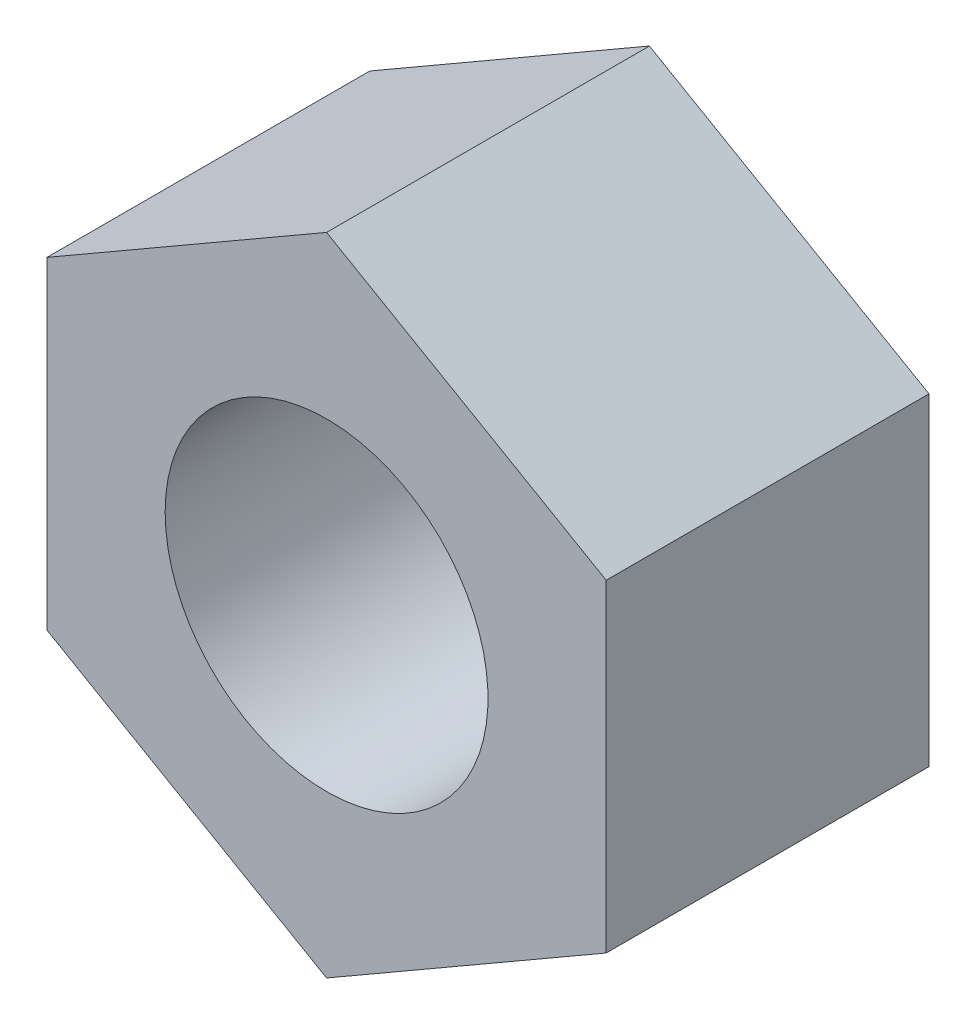
ISO-10303-21;
HEADER;
FILE_DESCRIPTION(('STEP AP214'),'2;1');
FILE_NAME('part.step','',(''),(''),'','','');
FILE_SCHEMA(('AUTOMOTIVE_DESIGN { 1 0 10303 214 1 1 1 1 }'));
ENDSEC;
DATA;
#1=APPLICATION_CONTEXT('core data for automotive mechanical design processes');
#2=APPLICATION_PROTOCOL_DEFINITION('international standard','automotive_design',2000,#1);
#3=PRODUCT_CONTEXT('',#1,'mechanical');
#4=PRODUCT('Part','Part','',(#3));
#5=PRODUCT_RELATED_PRODUCT_CATEGORY('part','',(#4));
#6=PRODUCT_DEFINITION_FORMATION('','',#4);
#7=PRODUCT_DEFINITION_CONTEXT('part definition',#1,'design');
#8=PRODUCT_DEFINITION('design','',#6,#7);
#9=PRODUCT_DEFINITION_SHAPE('','',#8);
#10=(LENGTH_UNIT() NAMED_UNIT(*) SI_UNIT(.MILLI.,.METRE.));
#11=(NAMED_UNIT(*) PLANE_ANGLE_UNIT() SI_UNIT($,.RADIAN.));
#12=(NAMED_UNIT(*) SI_UNIT($,.STERADIAN.) SOLID_ANGLE_UNIT());
#13=UNCERTAINTY_MEASURE_WITH_UNIT(LENGTH_MEASURE(1.E-05),#10,'distance_accuracy_value','');
#14=(GEOMETRIC_REPRESENTATION_CONTEXT(3) GLOBAL_UNCERTAINTY_ASSIGNED_CONTEXT((#13)) GLOBAL_UNIT_ASSIGNED_CONTEXT((#10,
#11,#12)) REPRESENTATION_CONTEXT('',''));
#15=CARTESIAN_POINT('',(0.,0.,0.));
#16=DIRECTION('',(0.,0.,1.));
#17=DIRECTION('',(1.,0.,0.));
#18=AXIS2_PLACEMENT_3D('',#15,#16,#17);
#19=CARTESIAN_POINT('',(2.59807621135332,1.5,3.));
#20=DIRECTION('',(-0.5,-0.866025403784439,0.));
#21=DIRECTION('',(0.866025403784439,-0.5,0.));
#22=AXIS2_PLACEMENT_3D('',#19,#20,#21);
#23=PLANE('',#22);
#24=DIRECTION('',(-0.866025403784439,0.5,0.));
#25=VECTOR('',#24,1.);
#26=CARTESIAN_POINT('',(2.59807621135332,1.5,0.));
#27=LINE('',#26,#25);
#28=CARTESIAN_POINT('',(2.59807621135332,1.5,0.));
#29=VERTEX_POINT('',#28);
#30=CARTESIAN_POINT('',(0.,3.,0.));
#31=VERTEX_POINT('',#30);
#32=EDGE_CURVE('E121',#29,#31,#27,.T.);
#33=ORIENTED_EDGE('',*,*,#32,.T.);
#34=DIRECTION('',(0.,0.,-1.));
#35=VECTOR('',#34,1.);
#36=CARTESIAN_POINT('',(0.,3.,3.));
#37=LINE('',#36,#35);
#38=CARTESIAN_POINT('',(0.,3.,3.));
#39=VERTEX_POINT('',#38);
#40=EDGE_CURVE('E11',#39,#31,#37,.T.);
#41=ORIENTED_EDGE('',*,*,#40,.F.);
#42=DIRECTION('',(-0.866025403784439,0.5,0.));
#43=VECTOR('',#42,1.);
#44=CARTESIAN_POINT('',(2.59807621135332,1.5,3.));
#45=LINE('',#44,#43);
#46=CARTESIAN_POINT('',(2.59807621135332,1.5,3.));
#47=VERTEX_POINT('',#46);
#48=EDGE_CURVE('E132',#47,#39,#45,.T.);
#49=ORIENTED_EDGE('',*,*,#48,.F.);
#50=DIRECTION('',(0.,0.,-1.));
#51=VECTOR('',#50,1.);
#52=CARTESIAN_POINT('',(2.59807621135332,1.5,3.));
#53=LINE('',#52,#51);
#54=EDGE_CURVE('E117',#47,#29,#53,.T.);
#55=ORIENTED_EDGE('',*,*,#54,.T.);
#56=EDGE_LOOP('',(#33,#41,#49,#55));
#57=FACE_BOUND('',#56,.T.);
#58=ADVANCED_FACE('F37',(#57),#23,.F.);
#59=CARTESIAN_POINT('',(0.,3.,3.));
#60=DIRECTION('',(0.5,-0.866025403784438,0.));
#61=DIRECTION('',(0.866025403784439,0.5,0.));
#62=AXIS2_PLACEMENT_3D('',#59,#60,#61);
#63=PLANE('',#62);
#64=DIRECTION('',(-0.866025403784439,-0.5,0.));
#65=VECTOR('',#64,1.);
#66=CARTESIAN_POINT('',(0.,3.,0.));
#67=LINE('',#66,#65);
#68=CARTESIAN_POINT('',(-2.59807621135332,1.5,0.));
#69=VERTEX_POINT('',#68);
#70=EDGE_CURVE('E124',#31,#69,#67,.T.);
#71=ORIENTED_EDGE('',*,*,#70,.T.);
#72=DIRECTION('',(0.,0.,-1.));
#73=VECTOR('',#72,1.);
#74=CARTESIAN_POINT('',(-2.59807621135332,1.5,3.));
#75=LINE('',#74,#73);
#76=CARTESIAN_POINT('',(-2.59807621135332,1.5,3.));
#77=VERTEX_POINT('',#76);
#78=EDGE_CURVE('E45',#77,#69,#75,.T.);
#79=ORIENTED_EDGE('',*,*,#78,.F.);
#80=DIRECTION('',(-0.866025403784439,-0.5,0.));
#81=VECTOR('',#80,1.);
#82=CARTESIAN_POINT('',(0.,3.,3.));
#83=LINE('',#82,#81);
#84=EDGE_CURVE('E90',#39,#77,#83,.T.);
#85=ORIENTED_EDGE('',*,*,#84,.F.);
#86=ORIENTED_EDGE('',*,*,#40,.T.);
#87=EDGE_LOOP('',(#71,#79,#85,#86));
#88=FACE_BOUND('',#87,.T.);
#89=ADVANCED_FACE('F157',(#88),#63,.F.);
#90=CARTESIAN_POINT('',(-2.59807621135332,1.5,3.));
#91=DIRECTION('',(1.,0.,0.));
#92=DIRECTION('',(0.,1.,0.));
#93=AXIS2_PLACEMENT_3D('',#90,#91,#92);
#94=PLANE('',#93);
#95=DIRECTION('',(0.,-1.,0.));
#96=VECTOR('',#95,1.);
#97=CARTESIAN_POINT('',(-2.59807621135332,1.5,0.));
#98=LINE('',#97,#96);
#99=CARTESIAN_POINT('',(-2.59807621135332,-1.5,0.));
#100=VERTEX_POINT('',#99);
#101=EDGE_CURVE('E127',#69,#100,#98,.T.);
#102=ORIENTED_EDGE('',*,*,#101,.T.);
#103=DIRECTION('',(0.,0.,-1.));
#104=VECTOR('',#103,1.);
#105=CARTESIAN_POINT('',(-2.59807621135332,-1.5,3.));
#106=LINE('',#105,#104);
#107=CARTESIAN_POINT('',(-2.59807621135332,-1.5,3.));
#108=VERTEX_POINT('',#107);
#109=EDGE_CURVE('E112',#108,#100,#106,.T.);
#110=ORIENTED_EDGE('',*,*,#109,.F.);
#111=DIRECTION('',(0.,-1.,0.));
#112=VECTOR('',#111,1.);
#113=CARTESIAN_POINT('',(-2.59807621135332,1.5,3.));
#114=LINE('',#113,#112);
#115=EDGE_CURVE('E103',#77,#108,#114,.T.);
#116=ORIENTED_EDGE('',*,*,#115,.F.);
#117=ORIENTED_EDGE('',*,*,#78,.T.);
#118=EDGE_LOOP('',(#102,#110,#116,#117));
#119=FACE_BOUND('',#118,.T.);
#120=ADVANCED_FACE('F138',(#119),#94,.F.);
#121=CARTESIAN_POINT('',(-2.59807621135332,-1.5,3.));
#122=DIRECTION('',(0.5,0.866025403784439,0.));
#123=DIRECTION('',(-0.866025403784439,0.5,0.));
#124=AXIS2_PLACEMENT_3D('',#121,#122,#123);
#125=PLANE('',#124);
#126=DIRECTION('',(0.866025403784439,-0.5,0.));
#127=VECTOR('',#126,1.);
#128=CARTESIAN_POINT('',(-2.59807621135332,-1.5,0.));
#129=LINE('',#128,#127);
#130=CARTESIAN_POINT('',(0.,-3.,0.));
#131=VERTEX_POINT('',#130);
#132=EDGE_CURVE('E111',#100,#131,#129,.T.);
#133=ORIENTED_EDGE('',*,*,#132,.T.);
#134=DIRECTION('',(0.,0.,-1.));
#135=VECTOR('',#134,1.);
#136=CARTESIAN_POINT('',(0.,-3.,3.));
#137=LINE('',#136,#135);
#138=CARTESIAN_POINT('',(0.,-3.,3.));
#139=VERTEX_POINT('',#138);
#140=EDGE_CURVE('E108',#139,#131,#137,.T.);
#141=ORIENTED_EDGE('',*,*,#140,.F.);
#142=DIRECTION('',(0.866025403784439,-0.5,0.));
#143=VECTOR('',#142,1.);
#144=CARTESIAN_POINT('',(-2.59807621135332,-1.5,3.));
#145=LINE('',#144,#143);
#146=EDGE_CURVE('E97',#108,#139,#145,.T.);
#147=ORIENTED_EDGE('',*,*,#146,.F.);
#148=ORIENTED_EDGE('',*,*,#109,.T.);
#149=EDGE_LOOP('',(#133,#141,#147,#148));
#150=FACE_BOUND('',#149,.T.);
#151=ADVANCED_FACE('F109',(#150),#125,.F.);
#152=CARTESIAN_POINT('',(0.,-3.,3.));
#153=DIRECTION('',(-0.5,0.866025403784439,0.));
#154=DIRECTION('',(-0.866025403784439,-0.5,0.));
#155=AXIS2_PLACEMENT_3D('',#152,#153,#154);
#156=PLANE('',#155);
#157=DIRECTION('',(0.866025403784439,0.5,0.));
#158=VECTOR('',#157,1.);
#159=CARTESIAN_POINT('',(0.,-3.,0.));
#160=LINE('',#159,#158);
#161=CARTESIAN_POINT('',(2.59807621135332,-1.5,0.));
#162=VERTEX_POINT('',#161);
#163=EDGE_CURVE('E76',#131,#162,#160,.T.);
#164=ORIENTED_EDGE('',*,*,#163,.T.);
#165=DIRECTION('',(0.,0.,-1.));
#166=VECTOR('',#165,1.);
#167=CARTESIAN_POINT('',(2.59807621135332,-1.5,3.));
#168=LINE('',#167,#166);
#169=CARTESIAN_POINT('',(2.59807621135332,-1.5,3.));
#170=VERTEX_POINT('',#169);
#171=EDGE_CURVE('E113',#170,#162,#168,.T.);
#172=ORIENTED_EDGE('',*,*,#171,.F.);
#173=DIRECTION('',(0.866025403784439,0.5,0.));
#174=VECTOR('',#173,1.);
#175=CARTESIAN_POINT('',(0.,-3.,3.));
#176=LINE('',#175,#174);
#177=EDGE_CURVE('E101',#139,#170,#176,.T.);
#178=ORIENTED_EDGE('',*,*,#177,.F.);
#179=ORIENTED_EDGE('',*,*,#140,.T.);
#180=EDGE_LOOP('',(#164,#172,#178,#179));
#181=FACE_BOUND('',#180,.T.);
#182=ADVANCED_FACE('F115',(#181),#156,.F.);
#183=CARTESIAN_POINT('',(2.59807621135332,-1.5,3.));
#184=DIRECTION('',(-1.,0.,0.));
#185=DIRECTION('',(0.,-1.,0.));
#186=AXIS2_PLACEMENT_3D('',#183,#184,#185);
#187=PLANE('',#186);
#188=DIRECTION('',(0.,1.,0.));
#189=VECTOR('',#188,1.);
#190=CARTESIAN_POINT('',(2.59807621135332,-1.5,0.));
#191=LINE('',#190,#189);
#192=EDGE_CURVE('E82',#162,#29,#191,.T.);
#193=ORIENTED_EDGE('',*,*,#192,.T.);
#194=ORIENTED_EDGE('',*,*,#54,.F.);
#195=DIRECTION('',(0.,1.,0.));
#196=VECTOR('',#195,1.);
#197=CARTESIAN_POINT('',(2.59807621135332,-1.5,3.));
#198=LINE('',#197,#196);
#199=EDGE_CURVE('E53',#170,#47,#198,.T.);
#200=ORIENTED_EDGE('',*,*,#199,.F.);
#201=ORIENTED_EDGE('',*,*,#171,.T.);
#202=EDGE_LOOP('',(#193,#194,#200,#201));
#203=FACE_BOUND('',#202,.T.);
#204=ADVANCED_FACE('F145',(#203),#187,.F.);
#205=CARTESIAN_POINT('',(0.,0.,3.));
#206=DIRECTION('',(0.,0.,1.));
#207=DIRECTION('',(1.,0.,0.));
#208=AXIS2_PLACEMENT_3D('',#205,#206,#207);
#209=PLANE('',#208);
#210=CARTESIAN_POINT('',(0.,0.,3.));
#211=DIRECTION('',(0.,0.,-1.));
#212=DIRECTION('',(-1.,0.,0.));
#213=AXIS2_PLACEMENT_3D('',#210,#211,#212);
#214=CIRCLE('',#213,1.5);
#215=CARTESIAN_POINT('',(-1.5,0.,3.));
#216=VERTEX_POINT('',#215);
#217=EDGE_CURVE('E125',#216,#216,#214,.T.);
#218=ORIENTED_EDGE('',*,*,#217,.T.);
#219=EDGE_LOOP('',(#218));
#220=FACE_BOUND('',#219,.T.);
#221=ORIENTED_EDGE('',*,*,#48,.T.);
#222=ORIENTED_EDGE('',*,*,#84,.T.);
#223=ORIENTED_EDGE('',*,*,#115,.T.);
#224=ORIENTED_EDGE('',*,*,#146,.T.);
#225=ORIENTED_EDGE('',*,*,#177,.T.);
#226=ORIENTED_EDGE('',*,*,#199,.T.);
#227=EDGE_LOOP('',(#221,#222,#223,#224,#225,#226));
#228=FACE_BOUND('',#227,.T.);
#229=ADVANCED_FACE('F99',(#220,#228),#209,.T.);
#230=CARTESIAN_POINT('',(0.,0.,0.));
#231=DIRECTION('',(0.,0.,1.));
#232=DIRECTION('',(1.,0.,0.));
#233=AXIS2_PLACEMENT_3D('',#230,#231,#232);
#234=PLANE('',#233);
#235=CARTESIAN_POINT('',(0.,0.,0.));
#236=DIRECTION('',(0.,0.,-1.));
#237=DIRECTION('',(-1.,0.,0.));
#238=AXIS2_PLACEMENT_3D('',#235,#236,#237);
#239=CIRCLE('',#238,1.5);
#240=CARTESIAN_POINT('',(-1.5,0.,0.));
#241=VERTEX_POINT('',#240);
#242=EDGE_CURVE('E212',#241,#241,#239,.T.);
#243=ORIENTED_EDGE('',*,*,#242,.F.);
#244=EDGE_LOOP('',(#243));
#245=FACE_BOUND('',#244,.T.);
#246=ORIENTED_EDGE('',*,*,#32,.F.);
#247=ORIENTED_EDGE('',*,*,#192,.F.);
#248=ORIENTED_EDGE('',*,*,#163,.F.);
#249=ORIENTED_EDGE('',*,*,#132,.F.);
#250=ORIENTED_EDGE('',*,*,#101,.F.);
#251=ORIENTED_EDGE('',*,*,#70,.F.);
#252=EDGE_LOOP('',(#246,#247,#248,#249,#250,#251));
#253=FACE_BOUND('',#252,.T.);
#254=ADVANCED_FACE('F141',(#245,#253),#234,.F.);
#255=CARTESIAN_POINT('',(0.,0.,3.));
#256=DIRECTION('',(0.,0.,-1.));
#257=DIRECTION('',(-1.,0.,0.));
#258=AXIS2_PLACEMENT_3D('',#255,#256,#257);
#259=CYLINDRICAL_SURFACE('',#258,1.5);
#260=ORIENTED_EDGE('',*,*,#217,.F.);
#261=EDGE_LOOP('',(#260));
#262=FACE_BOUND('',#261,.T.);
#263=ORIENTED_EDGE('',*,*,#242,.T.);
#264=EDGE_LOOP('',(#263));
#265=FACE_BOUND('',#264,.T.);
#266=ADVANCED_FACE('F194',(#262,#265),#259,.F.);
#267=CLOSED_SHELL('',(#58,#89,#120,#151,#182,#204,#229,#254,#266));
#268=MANIFOLD_SOLID_BREP('B2',#267);
#269=ADVANCED_BREP_SHAPE_REPRESENTATION('',(#18,#268),#14);
#270=SHAPE_DEFINITION_REPRESENTATION(#9,#269);
ENDSEC;
END-ISO-10303-21;
